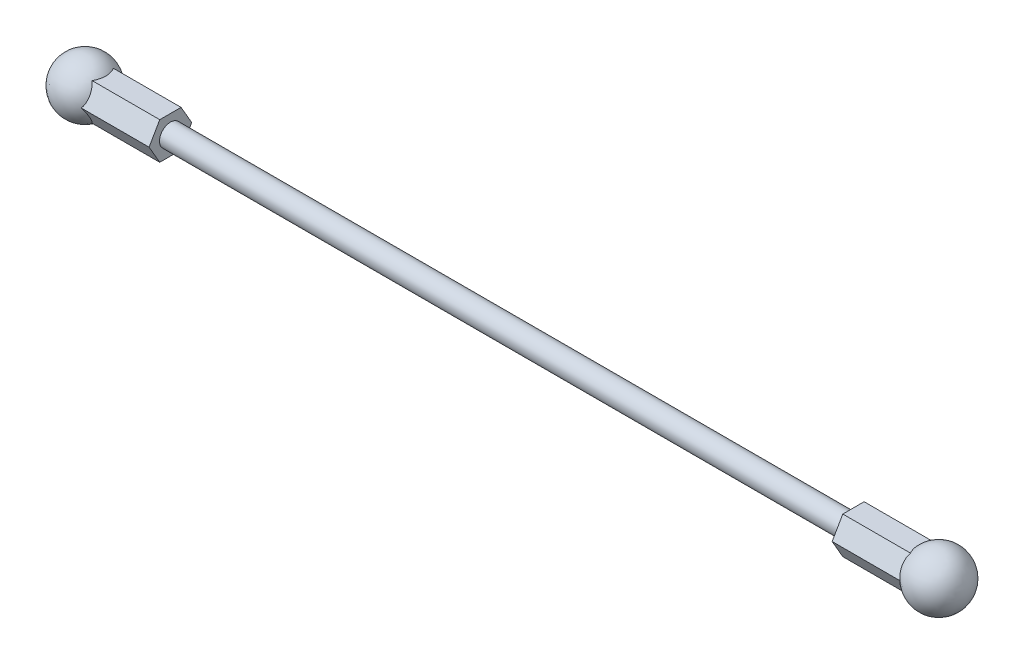
ISO-10303-21;
HEADER;
FILE_DESCRIPTION(('STEP AP214'),'2;1');
FILE_NAME('part.step','',(''),(''),'','','');
FILE_SCHEMA(('AUTOMOTIVE_DESIGN { 1 0 10303 214 1 1 1 1 }'));
ENDSEC;
DATA;
#1=APPLICATION_CONTEXT('core data for automotive mechanical design processes');
#2=APPLICATION_PROTOCOL_DEFINITION('international standard','automotive_design',2000,#1);
#3=PRODUCT_CONTEXT('',#1,'mechanical');
#4=PRODUCT('Part','Part','',(#3));
#5=PRODUCT_RELATED_PRODUCT_CATEGORY('part','',(#4));
#6=PRODUCT_DEFINITION_FORMATION('','',#4);
#7=PRODUCT_DEFINITION_CONTEXT('part definition',#1,'design');
#8=PRODUCT_DEFINITION('design','',#6,#7);
#9=PRODUCT_DEFINITION_SHAPE('','',#8);
#10=(LENGTH_UNIT() NAMED_UNIT(*) SI_UNIT(.MILLI.,.METRE.));
#11=(NAMED_UNIT(*) PLANE_ANGLE_UNIT() SI_UNIT($,.RADIAN.));
#12=(NAMED_UNIT(*) SI_UNIT($,.STERADIAN.) SOLID_ANGLE_UNIT());
#13=UNCERTAINTY_MEASURE_WITH_UNIT(LENGTH_MEASURE(1.E-05),#10,'distance_accuracy_value','');
#14=(GEOMETRIC_REPRESENTATION_CONTEXT(3) GLOBAL_UNCERTAINTY_ASSIGNED_CONTEXT((#13)) GLOBAL_UNIT_ASSIGNED_CONTEXT((#10,
#11,#12)) REPRESENTATION_CONTEXT('',''));
#15=CARTESIAN_POINT('',(0.,0.,0.));
#16=DIRECTION('',(0.,0.,1.));
#17=DIRECTION('',(1.,0.,0.));
#18=AXIS2_PLACEMENT_3D('',#15,#16,#17);
#19=CARTESIAN_POINT('',(83.25,2.,-1.15470053837925));
#20=DIRECTION('',(0.,-1.,0.));
#21=DIRECTION('',(0.,0.,-1.));
#22=AXIS2_PLACEMENT_3D('',#19,#20,#21);
#23=PLANE('',#22);
#24=DIRECTION('',(1.,0.,0.));
#25=VECTOR('',#24,1.);
#26=CARTESIAN_POINT('',(83.25,2.,-1.15470053837925));
#27=LINE('',#26,#25);
#28=CARTESIAN_POINT('',(83.25,2.,-1.15470053837925));
#29=VERTEX_POINT('',#28);
#30=CARTESIAN_POINT('',(90.5851457844873,2.,-1.15470053837925));
#31=VERTEX_POINT('',#30);
#32=EDGE_CURVE('E111',#29,#31,#27,.T.);
#33=ORIENTED_EDGE('',*,*,#32,.F.);
#34=DIRECTION('',(0.,0.,1.));
#35=VECTOR('',#34,1.);
#36=CARTESIAN_POINT('',(83.25,2.,-1.15470053837925));
#37=LINE('',#36,#35);
#38=CARTESIAN_POINT('',(83.25,2.,1.15470053837925));
#39=VERTEX_POINT('',#38);
#40=EDGE_CURVE('E101',#29,#39,#37,.T.);
#41=ORIENTED_EDGE('',*,*,#40,.T.);
#42=DIRECTION('',(1.,0.,0.));
#43=VECTOR('',#42,1.);
#44=CARTESIAN_POINT('',(83.25,2.,1.15470053837925));
#45=LINE('',#44,#43);
#46=CARTESIAN_POINT('',(90.5851457844873,2.,1.15470053837925));
#47=VERTEX_POINT('',#46);
#48=EDGE_CURVE('E65',#39,#47,#45,.T.);
#49=ORIENTED_EDGE('',*,*,#48,.T.);
#50=CARTESIAN_POINT('',(92.5,2.,0.));
#51=DIRECTION('',(0.,1.,0.));
#52=DIRECTION('',(0.,0.,-1.));
#53=AXIS2_PLACEMENT_3D('',#50,#51,#52);
#54=CIRCLE('',#53,2.23606797749979);
#55=EDGE_CURVE('E12',#31,#47,#54,.T.);
#56=ORIENTED_EDGE('',*,*,#55,.F.);
#57=EDGE_LOOP('',(#33,#41,#49,#56));
#58=FACE_BOUND('',#57,.T.);
#59=ADVANCED_FACE('F47',(#58),#23,.F.);
#60=CARTESIAN_POINT('',(83.25,2.,1.15470053837925));
#61=DIRECTION('',(0.,-0.5,-0.866025403784439));
#62=DIRECTION('',(0.,0.866025403784439,-0.5));
#63=AXIS2_PLACEMENT_3D('',#60,#61,#62);
#64=PLANE('',#63);
#65=ORIENTED_EDGE('',*,*,#48,.F.);
#66=DIRECTION('',(0.,-0.866025403784438,0.5));
#67=VECTOR('',#66,1.);
#68=CARTESIAN_POINT('',(83.25,2.,1.15470053837925));
#69=LINE('',#68,#67);
#70=CARTESIAN_POINT('',(83.25,0.,2.3094010767585));
#71=VERTEX_POINT('',#70);
#72=EDGE_CURVE('E99',#39,#71,#69,.T.);
#73=ORIENTED_EDGE('',*,*,#72,.T.);
#74=DIRECTION('',(1.,0.,0.));
#75=VECTOR('',#74,1.);
#76=CARTESIAN_POINT('',(83.25,0.,2.3094010767585));
#77=LINE('',#76,#75);
#78=CARTESIAN_POINT('',(90.5851457844873,0.,2.3094010767585));
#79=VERTEX_POINT('',#78);
#80=EDGE_CURVE('E139',#71,#79,#77,.T.);
#81=ORIENTED_EDGE('',*,*,#80,.T.);
#82=CARTESIAN_POINT('',(92.5,1.,1.73205080756888));
#83=DIRECTION('',(0.,0.5,0.866025403784439));
#84=DIRECTION('',(0.,0.866025403784439,-0.5));
#85=AXIS2_PLACEMENT_3D('',#82,#83,#84);
#86=CIRCLE('',#85,2.23606797749979);
#87=EDGE_CURVE('E55',#47,#79,#86,.T.);
#88=ORIENTED_EDGE('',*,*,#87,.F.);
#89=EDGE_LOOP('',(#65,#73,#81,#88));
#90=FACE_BOUND('',#89,.T.);
#91=ADVANCED_FACE('F107',(#90),#64,.F.);
#92=CARTESIAN_POINT('',(83.25,0.,2.3094010767585));
#93=DIRECTION('',(0.,0.5,-0.866025403784439));
#94=DIRECTION('',(0.,0.866025403784439,0.5));
#95=AXIS2_PLACEMENT_3D('',#92,#93,#94);
#96=PLANE('',#95);
#97=ORIENTED_EDGE('',*,*,#80,.F.);
#98=DIRECTION('',(0.,-0.866025403784439,-0.5));
#99=VECTOR('',#98,1.);
#100=CARTESIAN_POINT('',(83.25,0.,2.3094010767585));
#101=LINE('',#100,#99);
#102=CARTESIAN_POINT('',(83.25,-2.,1.15470053837925));
#103=VERTEX_POINT('',#102);
#104=EDGE_CURVE('E103',#71,#103,#101,.T.);
#105=ORIENTED_EDGE('',*,*,#104,.T.);
#106=DIRECTION('',(1.,0.,0.));
#107=VECTOR('',#106,1.);
#108=CARTESIAN_POINT('',(83.25,-2.,1.15470053837925));
#109=LINE('',#108,#107);
#110=CARTESIAN_POINT('',(90.5851457844873,-2.,1.15470053837925));
#111=VERTEX_POINT('',#110);
#112=EDGE_CURVE('E134',#103,#111,#109,.T.);
#113=ORIENTED_EDGE('',*,*,#112,.T.);
#114=CARTESIAN_POINT('',(92.5,-1.,1.73205080756888));
#115=DIRECTION('',(0.,-0.5,0.866025403784439));
#116=DIRECTION('',(0.,0.866025403784439,0.5));
#117=AXIS2_PLACEMENT_3D('',#114,#115,#116);
#118=CIRCLE('',#117,2.23606797749979);
#119=EDGE_CURVE('E109',#79,#111,#118,.T.);
#120=ORIENTED_EDGE('',*,*,#119,.F.);
#121=EDGE_LOOP('',(#97,#105,#113,#120));
#122=FACE_BOUND('',#121,.T.);
#123=ADVANCED_FACE('F157',(#122),#96,.F.);
#124=CARTESIAN_POINT('',(83.25,-2.,1.15470053837925));
#125=DIRECTION('',(0.,1.,0.));
#126=DIRECTION('',(0.,0.,1.));
#127=AXIS2_PLACEMENT_3D('',#124,#125,#126);
#128=PLANE('',#127);
#129=ORIENTED_EDGE('',*,*,#112,.F.);
#130=DIRECTION('',(0.,0.,-1.));
#131=VECTOR('',#130,1.);
#132=CARTESIAN_POINT('',(83.25,-2.,1.15470053837925));
#133=LINE('',#132,#131);
#134=CARTESIAN_POINT('',(83.25,-2.,-1.15470053837925));
#135=VERTEX_POINT('',#134);
#136=EDGE_CURVE('E118',#103,#135,#133,.T.);
#137=ORIENTED_EDGE('',*,*,#136,.T.);
#138=DIRECTION('',(1.,0.,0.));
#139=VECTOR('',#138,1.);
#140=CARTESIAN_POINT('',(83.25,-2.,-1.15470053837925));
#141=LINE('',#140,#139);
#142=CARTESIAN_POINT('',(90.5851457844873,-2.,-1.15470053837925));
#143=VERTEX_POINT('',#142);
#144=EDGE_CURVE('E129',#135,#143,#141,.T.);
#145=ORIENTED_EDGE('',*,*,#144,.T.);
#146=CARTESIAN_POINT('',(92.5,-2.,0.));
#147=DIRECTION('',(0.,-1.,0.));
#148=DIRECTION('',(0.,0.,1.));
#149=AXIS2_PLACEMENT_3D('',#146,#147,#148);
#150=CIRCLE('',#149,2.23606797749979);
#151=EDGE_CURVE('E136',#111,#143,#150,.T.);
#152=ORIENTED_EDGE('',*,*,#151,.F.);
#153=EDGE_LOOP('',(#129,#137,#145,#152));
#154=FACE_BOUND('',#153,.T.);
#155=ADVANCED_FACE('F155',(#154),#128,.F.);
#156=CARTESIAN_POINT('',(83.25,-2.,-1.15470053837925));
#157=DIRECTION('',(0.,0.5,0.866025403784439));
#158=DIRECTION('',(0.,-0.866025403784439,0.5));
#159=AXIS2_PLACEMENT_3D('',#156,#157,#158);
#160=PLANE('',#159);
#161=ORIENTED_EDGE('',*,*,#144,.F.);
#162=DIRECTION('',(0.,0.866025403784438,-0.5));
#163=VECTOR('',#162,1.);
#164=CARTESIAN_POINT('',(83.25,-2.,-1.15470053837925));
#165=LINE('',#164,#163);
#166=CARTESIAN_POINT('',(83.25,0.,-2.3094010767585));
#167=VERTEX_POINT('',#166);
#168=EDGE_CURVE('E121',#135,#167,#165,.T.);
#169=ORIENTED_EDGE('',*,*,#168,.T.);
#170=DIRECTION('',(1.,0.,0.));
#171=VECTOR('',#170,1.);
#172=CARTESIAN_POINT('',(83.25,0.,-2.3094010767585));
#173=LINE('',#172,#171);
#174=CARTESIAN_POINT('',(90.5851457844873,0.,-2.3094010767585));
#175=VERTEX_POINT('',#174);
#176=EDGE_CURVE('E126',#167,#175,#173,.T.);
#177=ORIENTED_EDGE('',*,*,#176,.T.);
#178=CARTESIAN_POINT('',(92.5,-1.,-1.73205080756888));
#179=DIRECTION('',(0.,-0.5,-0.866025403784439));
#180=DIRECTION('',(0.,-0.866025403784439,0.5));
#181=AXIS2_PLACEMENT_3D('',#178,#179,#180);
#182=CIRCLE('',#181,2.23606797749979);
#183=EDGE_CURVE('E131',#143,#175,#182,.T.);
#184=ORIENTED_EDGE('',*,*,#183,.F.);
#185=EDGE_LOOP('',(#161,#169,#177,#184));
#186=FACE_BOUND('',#185,.T.);
#187=ADVANCED_FACE('F152',(#186),#160,.F.);
#188=CARTESIAN_POINT('',(83.25,0.,-2.3094010767585));
#189=DIRECTION('',(0.,-0.5,0.866025403784439));
#190=DIRECTION('',(0.,-0.866025403784439,-0.5));
#191=AXIS2_PLACEMENT_3D('',#188,#189,#190);
#192=PLANE('',#191);
#193=ORIENTED_EDGE('',*,*,#176,.F.);
#194=DIRECTION('',(0.,0.866025403784439,0.5));
#195=VECTOR('',#194,1.);
#196=CARTESIAN_POINT('',(83.25,0.,-2.3094010767585));
#197=LINE('',#196,#195);
#198=EDGE_CURVE('E124',#167,#29,#197,.T.);
#199=ORIENTED_EDGE('',*,*,#198,.T.);
#200=ORIENTED_EDGE('',*,*,#32,.T.);
#201=CARTESIAN_POINT('',(92.5,1.,-1.73205080756888));
#202=DIRECTION('',(0.,0.5,-0.866025403784439));
#203=DIRECTION('',(0.,-0.866025403784439,-0.5));
#204=AXIS2_PLACEMENT_3D('',#201,#202,#203);
#205=CIRCLE('',#204,2.23606797749979);
#206=EDGE_CURVE('E112',#175,#31,#205,.T.);
#207=ORIENTED_EDGE('',*,*,#206,.F.);
#208=EDGE_LOOP('',(#193,#199,#200,#207));
#209=FACE_BOUND('',#208,.T.);
#210=ADVANCED_FACE('F148',(#209),#192,.F.);
#211=CARTESIAN_POINT('',(83.25,0.,0.));
#212=DIRECTION('',(-1.,0.,0.));
#213=DIRECTION('',(0.,0.,-1.));
#214=AXIS2_PLACEMENT_3D('',#211,#212,#213);
#215=PLANE('',#214);
#216=ORIENTED_EDGE('',*,*,#40,.F.);
#217=ORIENTED_EDGE('',*,*,#198,.F.);
#218=ORIENTED_EDGE('',*,*,#168,.F.);
#219=ORIENTED_EDGE('',*,*,#136,.F.);
#220=ORIENTED_EDGE('',*,*,#104,.F.);
#221=ORIENTED_EDGE('',*,*,#72,.F.);
#222=EDGE_LOOP('',(#216,#217,#218,#219,#220,#221));
#223=FACE_BOUND('',#222,.T.);
#224=ADVANCED_FACE('F100',(#223),#215,.T.);
#225=CARTESIAN_POINT('',(92.5,0.,0.));
#226=DIRECTION('',(0.,1.,0.));
#227=DIRECTION('',(0.,0.,-1.));
#228=AXIS2_PLACEMENT_3D('',#225,#226,#227);
#229=SPHERICAL_SURFACE('',#228,3.);
#230=ORIENTED_EDGE('',*,*,#206,.T.);
#231=ORIENTED_EDGE('',*,*,#55,.T.);
#232=ORIENTED_EDGE('',*,*,#87,.T.);
#233=ORIENTED_EDGE('',*,*,#119,.T.);
#234=ORIENTED_EDGE('',*,*,#151,.T.);
#235=ORIENTED_EDGE('',*,*,#183,.T.);
#236=EDGE_LOOP('',(#230,#231,#232,#233,#234,#235));
#237=FACE_BOUND('',#236,.T.);
#238=ADVANCED_FACE('F49',(#237),#229,.T.);
#239=CLOSED_SHELL('',(#59,#91,#123,#155,#187,#210,#224,#238));
#240=MANIFOLD_SOLID_BREP('B2',#239);
#241=CARTESIAN_POINT('',(0.,0.,0.));
#242=DIRECTION('',(0.,1.,0.));
#243=DIRECTION('',(-1.,0.,0.));
#244=AXIS2_PLACEMENT_3D('',#241,#242,#243);
#245=SPHERICAL_SURFACE('',#244,3.);
#246=CARTESIAN_POINT('',(0.,2.,0.));
#247=DIRECTION('',(0.,-1.,0.));
#248=DIRECTION('',(0.,0.,-1.));
#249=AXIS2_PLACEMENT_3D('',#246,#247,#248);
#250=CIRCLE('',#249,2.23606797749979);
#251=CARTESIAN_POINT('',(1.91485421551268,2.,-1.15470053837925));
#252=VERTEX_POINT('',#251);
#253=CARTESIAN_POINT('',(1.91485421551268,2.,1.15470053837925));
#254=VERTEX_POINT('',#253);
#255=EDGE_CURVE('E45',#252,#254,#250,.T.);
#256=ORIENTED_EDGE('',*,*,#255,.F.);
#257=CARTESIAN_POINT('',(0.,1.,-1.73205080756888));
#258=DIRECTION('',(0.,-0.5,0.866025403784439));
#259=DIRECTION('',(0.,-0.866025403784439,-0.5));
#260=AXIS2_PLACEMENT_3D('',#257,#258,#259);
#261=CIRCLE('',#260,2.23606797749979);
#262=CARTESIAN_POINT('',(1.91485421551268,0.,-2.3094010767585));
#263=VERTEX_POINT('',#262);
#264=EDGE_CURVE('E293',#263,#252,#261,.T.);
#265=ORIENTED_EDGE('',*,*,#264,.F.);
#266=CARTESIAN_POINT('',(0.,-1.,-1.73205080756888));
#267=DIRECTION('',(0.,0.5,0.866025403784439));
#268=DIRECTION('',(0.,-0.866025403784439,0.5));
#269=AXIS2_PLACEMENT_3D('',#266,#267,#268);
#270=CIRCLE('',#269,2.23606797749979);
#271=CARTESIAN_POINT('',(1.91485421551268,-2.,-1.15470053837925));
#272=VERTEX_POINT('',#271);
#273=EDGE_CURVE('E296',#272,#263,#270,.T.);
#274=ORIENTED_EDGE('',*,*,#273,.F.);
#275=CARTESIAN_POINT('',(0.,-2.,0.));
#276=DIRECTION('',(0.,1.,0.));
#277=DIRECTION('',(0.,0.,1.));
#278=AXIS2_PLACEMENT_3D('',#275,#276,#277);
#279=CIRCLE('',#278,2.23606797749979);
#280=CARTESIAN_POINT('',(1.91485421551268,-2.,1.15470053837925));
#281=VERTEX_POINT('',#280);
#282=EDGE_CURVE('E304',#281,#272,#279,.T.);
#283=ORIENTED_EDGE('',*,*,#282,.F.);
#284=CARTESIAN_POINT('',(0.,-1.,1.73205080756888));
#285=DIRECTION('',(0.,0.5,-0.866025403784439));
#286=DIRECTION('',(0.,0.866025403784439,0.5));
#287=AXIS2_PLACEMENT_3D('',#284,#285,#286);
#288=CIRCLE('',#287,2.23606797749979);
#289=CARTESIAN_POINT('',(1.91485421551268,0.,2.3094010767585));
#290=VERTEX_POINT('',#289);
#291=EDGE_CURVE('E240',#290,#281,#288,.T.);
#292=ORIENTED_EDGE('',*,*,#291,.F.);
#293=CARTESIAN_POINT('',(0.,1.,1.73205080756888));
#294=DIRECTION('',(0.,-0.5,-0.866025403784439));
#295=DIRECTION('',(0.,0.866025403784439,-0.5));
#296=AXIS2_PLACEMENT_3D('',#293,#294,#295);
#297=CIRCLE('',#296,2.23606797749979);
#298=EDGE_CURVE('E230',#254,#290,#297,.T.);
#299=ORIENTED_EDGE('',*,*,#298,.F.);
#300=EDGE_LOOP('',(#256,#265,#274,#283,#292,#299));
#301=FACE_BOUND('',#300,.T.);
#302=ADVANCED_FACE('F223',(#301),#245,.T.);
#303=CARTESIAN_POINT('',(9.25,2.,-1.15470053837925));
#304=DIRECTION('',(0.,-1.,0.));
#305=DIRECTION('',(0.,0.,-1.));
#306=AXIS2_PLACEMENT_3D('',#303,#304,#305);
#307=PLANE('',#306);
#308=DIRECTION('',(-1.,0.,0.));
#309=VECTOR('',#308,1.);
#310=CARTESIAN_POINT('',(9.25,2.,-1.15470053837925));
#311=LINE('',#310,#309);
#312=CARTESIAN_POINT('',(9.25,2.,-1.15470053837925));
#313=VERTEX_POINT('',#312);
#314=EDGE_CURVE('E319',#313,#252,#311,.T.);
#315=ORIENTED_EDGE('',*,*,#314,.T.);
#316=ORIENTED_EDGE('',*,*,#255,.T.);
#317=DIRECTION('',(-1.,0.,0.));
#318=VECTOR('',#317,1.);
#319=CARTESIAN_POINT('',(9.25,2.,1.15470053837925));
#320=LINE('',#319,#318);
#321=CARTESIAN_POINT('',(9.25,2.,1.15470053837925));
#322=VERTEX_POINT('',#321);
#323=EDGE_CURVE('E275',#322,#254,#320,.T.);
#324=ORIENTED_EDGE('',*,*,#323,.F.);
#325=DIRECTION('',(0.,0.,1.));
#326=VECTOR('',#325,1.);
#327=CARTESIAN_POINT('',(9.25,2.,-1.15470053837925));
#328=LINE('',#327,#326);
#329=EDGE_CURVE('E281',#313,#322,#328,.T.);
#330=ORIENTED_EDGE('',*,*,#329,.F.);
#331=EDGE_LOOP('',(#315,#316,#324,#330));
#332=FACE_BOUND('',#331,.T.);
#333=ADVANCED_FACE('F292',(#332),#307,.F.);
#334=CARTESIAN_POINT('',(9.25,2.,1.15470053837925));
#335=DIRECTION('',(0.,-0.5,-0.866025403784439));
#336=DIRECTION('',(0.,0.866025403784439,-0.5));
#337=AXIS2_PLACEMENT_3D('',#334,#335,#336);
#338=PLANE('',#337);
#339=ORIENTED_EDGE('',*,*,#323,.T.);
#340=ORIENTED_EDGE('',*,*,#298,.T.);
#341=DIRECTION('',(-1.,0.,0.));
#342=VECTOR('',#341,1.);
#343=CARTESIAN_POINT('',(9.25,0.,2.3094010767585));
#344=LINE('',#343,#342);
#345=CARTESIAN_POINT('',(9.25,0.,2.3094010767585));
#346=VERTEX_POINT('',#345);
#347=EDGE_CURVE('E277',#346,#290,#344,.T.);
#348=ORIENTED_EDGE('',*,*,#347,.F.);
#349=DIRECTION('',(0.,-0.866025403784438,0.5));
#350=VECTOR('',#349,1.);
#351=CARTESIAN_POINT('',(9.25,2.,1.15470053837925));
#352=LINE('',#351,#350);
#353=EDGE_CURVE('E271',#322,#346,#352,.T.);
#354=ORIENTED_EDGE('',*,*,#353,.F.);
#355=EDGE_LOOP('',(#339,#340,#348,#354));
#356=FACE_BOUND('',#355,.T.);
#357=ADVANCED_FACE('F273',(#356),#338,.F.);
#358=CARTESIAN_POINT('',(9.25,0.,2.3094010767585));
#359=DIRECTION('',(0.,0.5,-0.866025403784439));
#360=DIRECTION('',(0.,0.866025403784439,0.5));
#361=AXIS2_PLACEMENT_3D('',#358,#359,#360);
#362=PLANE('',#361);
#363=ORIENTED_EDGE('',*,*,#347,.T.);
#364=ORIENTED_EDGE('',*,*,#291,.T.);
#365=DIRECTION('',(-1.,0.,0.));
#366=VECTOR('',#365,1.);
#367=CARTESIAN_POINT('',(9.25,-2.,1.15470053837925));
#368=LINE('',#367,#366);
#369=CARTESIAN_POINT('',(9.25,-2.,1.15470053837925));
#370=VERTEX_POINT('',#369);
#371=EDGE_CURVE('E298',#370,#281,#368,.T.);
#372=ORIENTED_EDGE('',*,*,#371,.F.);
#373=DIRECTION('',(0.,-0.866025403784439,-0.5));
#374=VECTOR('',#373,1.);
#375=CARTESIAN_POINT('',(9.25,0.,2.3094010767585));
#376=LINE('',#375,#374);
#377=EDGE_CURVE('E280',#346,#370,#376,.T.);
#378=ORIENTED_EDGE('',*,*,#377,.F.);
#379=EDGE_LOOP('',(#363,#364,#372,#378));
#380=FACE_BOUND('',#379,.T.);
#381=ADVANCED_FACE('F308',(#380),#362,.F.);
#382=CARTESIAN_POINT('',(9.25,-2.,1.15470053837925));
#383=DIRECTION('',(0.,1.,0.));
#384=DIRECTION('',(0.,0.,1.));
#385=AXIS2_PLACEMENT_3D('',#382,#383,#384);
#386=PLANE('',#385);
#387=ORIENTED_EDGE('',*,*,#371,.T.);
#388=ORIENTED_EDGE('',*,*,#282,.T.);
#389=DIRECTION('',(-1.,0.,0.));
#390=VECTOR('',#389,1.);
#391=CARTESIAN_POINT('',(9.25,-2.,-1.15470053837925));
#392=LINE('',#391,#390);
#393=CARTESIAN_POINT('',(9.25,-2.,-1.15470053837925));
#394=VERTEX_POINT('',#393);
#395=EDGE_CURVE('E324',#394,#272,#392,.T.);
#396=ORIENTED_EDGE('',*,*,#395,.F.);
#397=DIRECTION('',(0.,0.,-1.));
#398=VECTOR('',#397,1.);
#399=CARTESIAN_POINT('',(9.25,-2.,1.15470053837925));
#400=LINE('',#399,#398);
#401=EDGE_CURVE('E312',#370,#394,#400,.T.);
#402=ORIENTED_EDGE('',*,*,#401,.F.);
#403=EDGE_LOOP('',(#387,#388,#396,#402));
#404=FACE_BOUND('',#403,.T.);
#405=ADVANCED_FACE('F327',(#404),#386,.F.);
#406=CARTESIAN_POINT('',(9.25,-2.,-1.15470053837925));
#407=DIRECTION('',(0.,0.5,0.866025403784439));
#408=DIRECTION('',(0.,-0.866025403784439,0.5));
#409=AXIS2_PLACEMENT_3D('',#406,#407,#408);
#410=PLANE('',#409);
#411=ORIENTED_EDGE('',*,*,#395,.T.);
#412=ORIENTED_EDGE('',*,*,#273,.T.);
#413=DIRECTION('',(-1.,0.,0.));
#414=VECTOR('',#413,1.);
#415=CARTESIAN_POINT('',(9.25,0.,-2.3094010767585));
#416=LINE('',#415,#414);
#417=CARTESIAN_POINT('',(9.25,0.,-2.3094010767585));
#418=VERTEX_POINT('',#417);
#419=EDGE_CURVE('E321',#418,#263,#416,.T.);
#420=ORIENTED_EDGE('',*,*,#419,.F.);
#421=DIRECTION('',(0.,0.866025403784438,-0.5));
#422=VECTOR('',#421,1.);
#423=CARTESIAN_POINT('',(9.25,-2.,-1.15470053837925));
#424=LINE('',#423,#422);
#425=EDGE_CURVE('E314',#394,#418,#424,.T.);
#426=ORIENTED_EDGE('',*,*,#425,.F.);
#427=EDGE_LOOP('',(#411,#412,#420,#426));
#428=FACE_BOUND('',#427,.T.);
#429=ADVANCED_FACE('F332',(#428),#410,.F.);
#430=CARTESIAN_POINT('',(9.25,0.,-2.3094010767585));
#431=DIRECTION('',(0.,-0.5,0.866025403784439));
#432=DIRECTION('',(0.,-0.866025403784439,-0.5));
#433=AXIS2_PLACEMENT_3D('',#430,#431,#432);
#434=PLANE('',#433);
#435=ORIENTED_EDGE('',*,*,#419,.T.);
#436=ORIENTED_EDGE('',*,*,#264,.T.);
#437=ORIENTED_EDGE('',*,*,#314,.F.);
#438=DIRECTION('',(0.,0.866025403784439,0.5));
#439=VECTOR('',#438,1.);
#440=CARTESIAN_POINT('',(9.25,0.,-2.3094010767585));
#441=LINE('',#440,#439);
#442=EDGE_CURVE('E286',#418,#313,#441,.T.);
#443=ORIENTED_EDGE('',*,*,#442,.F.);
#444=EDGE_LOOP('',(#435,#436,#437,#443));
#445=FACE_BOUND('',#444,.T.);
#446=ADVANCED_FACE('F334',(#445),#434,.F.);
#447=CARTESIAN_POINT('',(9.25,0.,0.));
#448=DIRECTION('',(1.,0.,0.));
#449=DIRECTION('',(0.,0.,-1.));
#450=AXIS2_PLACEMENT_3D('',#447,#448,#449);
#451=PLANE('',#450);
#452=CARTESIAN_POINT('',(9.25,0.,-0.00793613059507685));
#453=DIRECTION('',(1.,0.,0.));
#454=DIRECTION('',(0.,0.,-1.));
#455=AXIS2_PLACEMENT_3D('',#452,#453,#454);
#456=CIRCLE('',#455,1.190625);
#457=CARTESIAN_POINT('',(9.25,0.,-1.19856113059508));
#458=VERTEX_POINT('',#457);
#459=EDGE_CURVE('E366',#458,#458,#456,.T.);
#460=ORIENTED_EDGE('',*,*,#459,.F.);
#461=EDGE_LOOP('',(#460));
#462=FACE_BOUND('',#461,.T.);
#463=ORIENTED_EDGE('',*,*,#329,.T.);
#464=ORIENTED_EDGE('',*,*,#353,.T.);
#465=ORIENTED_EDGE('',*,*,#377,.T.);
#466=ORIENTED_EDGE('',*,*,#401,.T.);
#467=ORIENTED_EDGE('',*,*,#425,.T.);
#468=ORIENTED_EDGE('',*,*,#442,.T.);
#469=EDGE_LOOP('',(#463,#464,#465,#466,#467,#468));
#470=FACE_BOUND('',#469,.T.);
#471=ADVANCED_FACE('F284',(#462,#470),#451,.T.);
#472=CARTESIAN_POINT('',(86.6175960454009,0.,-0.00793613059507685));
#473=DIRECTION('',(-1.,0.,0.));
#474=DIRECTION('',(0.,0.,1.));
#475=AXIS2_PLACEMENT_3D('',#472,#473,#474);
#476=CYLINDRICAL_SURFACE('',#475,1.190625);
#477=CARTESIAN_POINT('',(83.25,0.,-0.00793613059507685));
#478=DIRECTION('',(-1.,0.,0.));
#479=DIRECTION('',(0.,0.,1.));
#480=AXIS2_PLACEMENT_3D('',#477,#478,#479);
#481=CIRCLE('',#480,1.190625);
#482=CARTESIAN_POINT('',(83.25,0.,1.18268886940492));
#483=VERTEX_POINT('',#482);
#484=EDGE_CURVE('E290',#483,#483,#481,.T.);
#485=ORIENTED_EDGE('',*,*,#484,.T.);
#486=EDGE_LOOP('',(#485));
#487=FACE_BOUND('',#486,.T.);
#488=ORIENTED_EDGE('',*,*,#459,.T.);
#489=EDGE_LOOP('',(#488));
#490=FACE_BOUND('',#489,.T.);
#491=ADVANCED_FACE('F354',(#487,#490),#476,.T.);
#492=CARTESIAN_POINT('',(83.25,0.,0.));
#493=DIRECTION('',(-1.,0.,0.));
#494=DIRECTION('',(0.,0.,-1.));
#495=AXIS2_PLACEMENT_3D('',#492,#493,#494);
#496=PLANE('',#495);
#497=ORIENTED_EDGE('',*,*,#484,.F.);
#498=EDGE_LOOP('',(#497));
#499=FACE_BOUND('',#498,.T.);
#500=ADVANCED_FACE('F358',(#499),#496,.F.);
#501=CLOSED_SHELL('',(#302,#333,#357,#381,#405,#429,#446,#471,#491,#500));
#502=MANIFOLD_SOLID_BREP('B6',#501);
#503=ADVANCED_BREP_SHAPE_REPRESENTATION('',(#18,#240,#502),#14);
#504=SHAPE_DEFINITION_REPRESENTATION(#9,#503);
ENDSEC;
END-ISO-10303-21;
